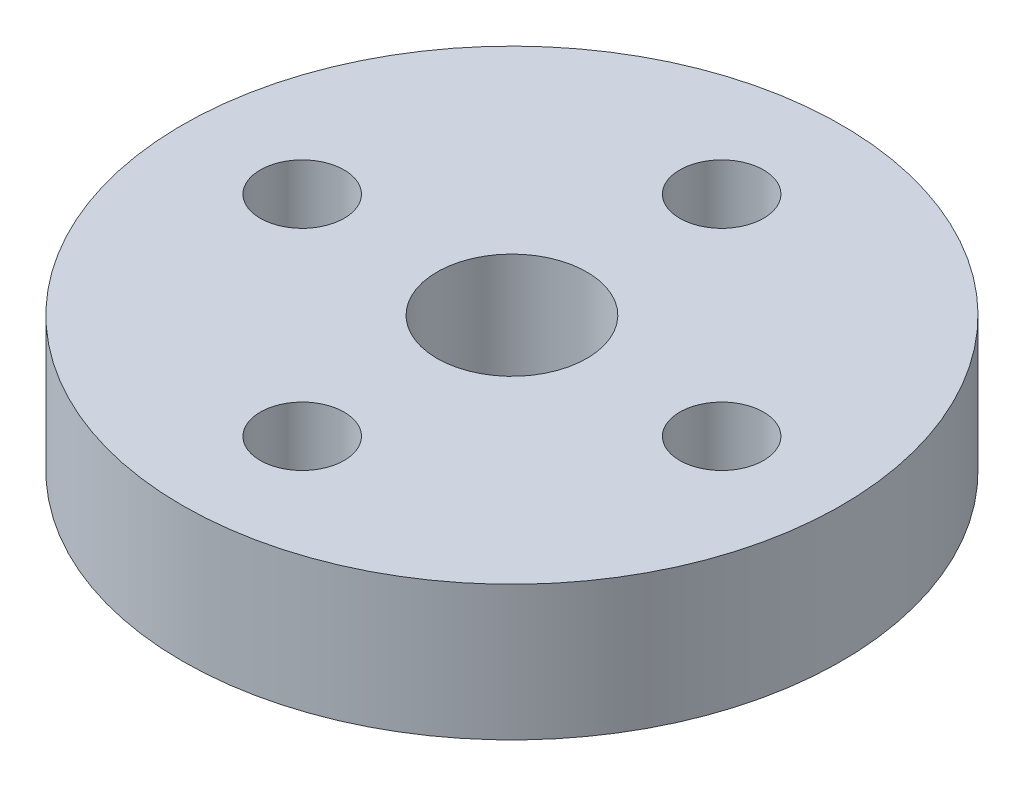
ISO-10303-21;
HEADER;
FILE_DESCRIPTION(('STEP AP214'),'2;1');
FILE_NAME('part.step','',(''),(''),'','','');
FILE_SCHEMA(('AUTOMOTIVE_DESIGN { 1 0 10303 214 1 1 1 1 }'));
ENDSEC;
DATA;
#1=APPLICATION_CONTEXT('core data for automotive mechanical design processes');
#2=APPLICATION_PROTOCOL_DEFINITION('international standard','automotive_design',2000,#1);
#3=PRODUCT_CONTEXT('',#1,'mechanical');
#4=PRODUCT('Part','Part','',(#3));
#5=PRODUCT_RELATED_PRODUCT_CATEGORY('part','',(#4));
#6=PRODUCT_DEFINITION_FORMATION('','',#4);
#7=PRODUCT_DEFINITION_CONTEXT('part definition',#1,'design');
#8=PRODUCT_DEFINITION('design','',#6,#7);
#9=PRODUCT_DEFINITION_SHAPE('','',#8);
#10=(LENGTH_UNIT() NAMED_UNIT(*) SI_UNIT(.MILLI.,.METRE.));
#11=(NAMED_UNIT(*) PLANE_ANGLE_UNIT() SI_UNIT($,.RADIAN.));
#12=(NAMED_UNIT(*) SI_UNIT($,.STERADIAN.) SOLID_ANGLE_UNIT());
#13=UNCERTAINTY_MEASURE_WITH_UNIT(LENGTH_MEASURE(1.E-05),#10,'distance_accuracy_value','');
#14=(GEOMETRIC_REPRESENTATION_CONTEXT(3) GLOBAL_UNCERTAINTY_ASSIGNED_CONTEXT((#13)) GLOBAL_UNIT_ASSIGNED_CONTEXT((#10,
#11,#12)) REPRESENTATION_CONTEXT('',''));
#15=CARTESIAN_POINT('',(0.,0.,0.));
#16=DIRECTION('',(0.,0.,1.));
#17=DIRECTION('',(1.,0.,0.));
#18=AXIS2_PLACEMENT_3D('',#15,#16,#17);
#19=CARTESIAN_POINT('',(0.,4.5,0.));
#20=DIRECTION('',(0.,1.,0.));
#21=DIRECTION('',(0.,0.,1.));
#22=AXIS2_PLACEMENT_3D('',#19,#20,#21);
#23=PLANE('',#22);
#24=CARTESIAN_POINT('',(0.,4.5,7.));
#25=DIRECTION('',(0.,1.,0.));
#26=DIRECTION('',(0.,0.,1.));
#27=AXIS2_PLACEMENT_3D('',#24,#25,#26);
#28=CIRCLE('',#27,1.4);
#29=CARTESIAN_POINT('',(0.,4.5,8.4));
#30=VERTEX_POINT('',#29);
#31=EDGE_CURVE('E76',#30,#30,#28,.T.);
#32=ORIENTED_EDGE('',*,*,#31,.F.);
#33=EDGE_LOOP('',(#32));
#34=FACE_BOUND('',#33,.T.);
#35=CARTESIAN_POINT('',(0.,4.5,-7.));
#36=DIRECTION('',(0.,1.,0.));
#37=DIRECTION('',(0.,0.,1.));
#38=AXIS2_PLACEMENT_3D('',#35,#36,#37);
#39=CIRCLE('',#38,1.4);
#40=CARTESIAN_POINT('',(0.,4.5,-5.6));
#41=VERTEX_POINT('',#40);
#42=EDGE_CURVE('E60',#41,#41,#39,.T.);
#43=ORIENTED_EDGE('',*,*,#42,.F.);
#44=EDGE_LOOP('',(#43));
#45=FACE_BOUND('',#44,.T.);
#46=CARTESIAN_POINT('',(0.,4.5,0.));
#47=DIRECTION('',(0.,1.,0.));
#48=DIRECTION('',(0.,0.,1.));
#49=AXIS2_PLACEMENT_3D('',#46,#47,#48);
#50=CIRCLE('',#49,11.);
#51=CARTESIAN_POINT('',(0.,4.5,11.));
#52=VERTEX_POINT('',#51);
#53=EDGE_CURVE('E10',#52,#52,#50,.T.);
#54=ORIENTED_EDGE('',*,*,#53,.T.);
#55=EDGE_LOOP('',(#54));
#56=FACE_BOUND('',#55,.T.);
#57=CARTESIAN_POINT('',(0.,4.5,0.));
#58=DIRECTION('',(0.,1.,0.));
#59=DIRECTION('',(0.,0.,1.));
#60=AXIS2_PLACEMENT_3D('',#57,#58,#59);
#61=CIRCLE('',#60,2.5);
#62=CARTESIAN_POINT('',(0.,4.5,2.5));
#63=VERTEX_POINT('',#62);
#64=EDGE_CURVE('E54',#63,#63,#61,.T.);
#65=ORIENTED_EDGE('',*,*,#64,.F.);
#66=EDGE_LOOP('',(#65));
#67=FACE_BOUND('',#66,.T.);
#68=CARTESIAN_POINT('',(7.,4.5,0.));
#69=DIRECTION('',(0.,1.,0.));
#70=DIRECTION('',(0.,0.,1.));
#71=AXIS2_PLACEMENT_3D('',#68,#69,#70);
#72=CIRCLE('',#71,1.4);
#73=CARTESIAN_POINT('',(7.,4.5,1.4));
#74=VERTEX_POINT('',#73);
#75=EDGE_CURVE('E68',#74,#74,#72,.T.);
#76=ORIENTED_EDGE('',*,*,#75,.F.);
#77=EDGE_LOOP('',(#76));
#78=FACE_BOUND('',#77,.T.);
#79=CARTESIAN_POINT('',(-7.,4.5,0.));
#80=DIRECTION('',(0.,1.,0.));
#81=DIRECTION('',(0.,0.,1.));
#82=AXIS2_PLACEMENT_3D('',#79,#80,#81);
#83=CIRCLE('',#82,1.4);
#84=CARTESIAN_POINT('',(-7.,4.5,1.4));
#85=VERTEX_POINT('',#84);
#86=EDGE_CURVE('E84',#85,#85,#83,.T.);
#87=ORIENTED_EDGE('',*,*,#86,.F.);
#88=EDGE_LOOP('',(#87));
#89=FACE_BOUND('',#88,.T.);
#90=ADVANCED_FACE('F41',(#34,#45,#56,#67,#78,#89),#23,.T.);
#91=CARTESIAN_POINT('',(0.,0.,0.));
#92=DIRECTION('',(0.,1.,0.));
#93=DIRECTION('',(0.,0.,1.));
#94=AXIS2_PLACEMENT_3D('',#91,#92,#93);
#95=PLANE('',#94);
#96=CARTESIAN_POINT('',(0.,0.,0.));
#97=DIRECTION('',(0.,1.,0.));
#98=DIRECTION('',(0.,0.,1.));
#99=AXIS2_PLACEMENT_3D('',#96,#97,#98);
#100=CIRCLE('',#99,11.);
#101=CARTESIAN_POINT('',(0.,0.,11.));
#102=VERTEX_POINT('',#101);
#103=EDGE_CURVE('E45',#102,#102,#100,.T.);
#104=ORIENTED_EDGE('',*,*,#103,.F.);
#105=EDGE_LOOP('',(#104));
#106=FACE_BOUND('',#105,.T.);
#107=CARTESIAN_POINT('',(0.,0.,0.));
#108=DIRECTION('',(0.,1.,0.));
#109=DIRECTION('',(0.,0.,1.));
#110=AXIS2_PLACEMENT_3D('',#107,#108,#109);
#111=CIRCLE('',#110,2.5);
#112=CARTESIAN_POINT('',(0.,0.,2.5));
#113=VERTEX_POINT('',#112);
#114=EDGE_CURVE('E56',#113,#113,#111,.T.);
#115=ORIENTED_EDGE('',*,*,#114,.T.);
#116=EDGE_LOOP('',(#115));
#117=FACE_BOUND('',#116,.T.);
#118=CARTESIAN_POINT('',(0.,0.,-7.));
#119=DIRECTION('',(0.,1.,0.));
#120=DIRECTION('',(0.,0.,1.));
#121=AXIS2_PLACEMENT_3D('',#118,#119,#120);
#122=CIRCLE('',#121,1.4);
#123=CARTESIAN_POINT('',(0.,0.,-5.6));
#124=VERTEX_POINT('',#123);
#125=EDGE_CURVE('E64',#124,#124,#122,.T.);
#126=ORIENTED_EDGE('',*,*,#125,.T.);
#127=EDGE_LOOP('',(#126));
#128=FACE_BOUND('',#127,.T.);
#129=CARTESIAN_POINT('',(7.,0.,0.));
#130=DIRECTION('',(0.,1.,0.));
#131=DIRECTION('',(0.,0.,1.));
#132=AXIS2_PLACEMENT_3D('',#129,#130,#131);
#133=CIRCLE('',#132,1.4);
#134=CARTESIAN_POINT('',(7.,0.,1.4));
#135=VERTEX_POINT('',#134);
#136=EDGE_CURVE('E72',#135,#135,#133,.T.);
#137=ORIENTED_EDGE('',*,*,#136,.T.);
#138=EDGE_LOOP('',(#137));
#139=FACE_BOUND('',#138,.T.);
#140=CARTESIAN_POINT('',(0.,0.,7.));
#141=DIRECTION('',(0.,1.,0.));
#142=DIRECTION('',(0.,0.,1.));
#143=AXIS2_PLACEMENT_3D('',#140,#141,#142);
#144=CIRCLE('',#143,1.4);
#145=CARTESIAN_POINT('',(0.,0.,8.4));
#146=VERTEX_POINT('',#145);
#147=EDGE_CURVE('E80',#146,#146,#144,.T.);
#148=ORIENTED_EDGE('',*,*,#147,.T.);
#149=EDGE_LOOP('',(#148));
#150=FACE_BOUND('',#149,.T.);
#151=CARTESIAN_POINT('',(-7.,0.,0.));
#152=DIRECTION('',(0.,1.,0.));
#153=DIRECTION('',(0.,0.,1.));
#154=AXIS2_PLACEMENT_3D('',#151,#152,#153);
#155=CIRCLE('',#154,1.4);
#156=CARTESIAN_POINT('',(-7.,0.,1.4));
#157=VERTEX_POINT('',#156);
#158=EDGE_CURVE('E88',#157,#157,#155,.T.);
#159=ORIENTED_EDGE('',*,*,#158,.T.);
#160=EDGE_LOOP('',(#159));
#161=FACE_BOUND('',#160,.T.);
#162=ADVANCED_FACE('F100',(#106,#117,#128,#139,#150,#161),#95,.F.);
#163=CARTESIAN_POINT('',(0.,4.5,0.));
#164=DIRECTION('',(0.,-1.,0.));
#165=DIRECTION('',(0.,0.,-1.));
#166=AXIS2_PLACEMENT_3D('',#163,#164,#165);
#167=CYLINDRICAL_SURFACE('',#166,11.);
#168=ORIENTED_EDGE('',*,*,#53,.F.);
#169=EDGE_LOOP('',(#168));
#170=FACE_BOUND('',#169,.T.);
#171=ORIENTED_EDGE('',*,*,#103,.T.);
#172=EDGE_LOOP('',(#171));
#173=FACE_BOUND('',#172,.T.);
#174=ADVANCED_FACE('F43',(#170,#173),#167,.T.);
#175=CARTESIAN_POINT('',(0.,4.5,0.));
#176=DIRECTION('',(0.,-1.,0.));
#177=DIRECTION('',(0.,0.,-1.));
#178=AXIS2_PLACEMENT_3D('',#175,#176,#177);
#179=CYLINDRICAL_SURFACE('',#178,2.5);
#180=ORIENTED_EDGE('',*,*,#64,.T.);
#181=EDGE_LOOP('',(#180));
#182=FACE_BOUND('',#181,.T.);
#183=ORIENTED_EDGE('',*,*,#114,.F.);
#184=EDGE_LOOP('',(#183));
#185=FACE_BOUND('',#184,.T.);
#186=ADVANCED_FACE('F110',(#182,#185),#179,.F.);
#187=CARTESIAN_POINT('',(0.,4.5,-7.));
#188=DIRECTION('',(0.,-1.,0.));
#189=DIRECTION('',(0.,0.,-1.));
#190=AXIS2_PLACEMENT_3D('',#187,#188,#189);
#191=CYLINDRICAL_SURFACE('',#190,1.4);
#192=ORIENTED_EDGE('',*,*,#42,.T.);
#193=EDGE_LOOP('',(#192));
#194=FACE_BOUND('',#193,.T.);
#195=ORIENTED_EDGE('',*,*,#125,.F.);
#196=EDGE_LOOP('',(#195));
#197=FACE_BOUND('',#196,.T.);
#198=ADVANCED_FACE('F113',(#194,#197),#191,.F.);
#199=CARTESIAN_POINT('',(7.,4.5,0.));
#200=DIRECTION('',(0.,-1.,0.));
#201=DIRECTION('',(0.,0.,-1.));
#202=AXIS2_PLACEMENT_3D('',#199,#200,#201);
#203=CYLINDRICAL_SURFACE('',#202,1.4);
#204=ORIENTED_EDGE('',*,*,#75,.T.);
#205=EDGE_LOOP('',(#204));
#206=FACE_BOUND('',#205,.T.);
#207=ORIENTED_EDGE('',*,*,#136,.F.);
#208=EDGE_LOOP('',(#207));
#209=FACE_BOUND('',#208,.T.);
#210=ADVANCED_FACE('F117',(#206,#209),#203,.F.);
#211=CARTESIAN_POINT('',(0.,4.5,7.));
#212=DIRECTION('',(0.,-1.,0.));
#213=DIRECTION('',(0.,0.,-1.));
#214=AXIS2_PLACEMENT_3D('',#211,#212,#213);
#215=CYLINDRICAL_SURFACE('',#214,1.4);
#216=ORIENTED_EDGE('',*,*,#31,.T.);
#217=EDGE_LOOP('',(#216));
#218=FACE_BOUND('',#217,.T.);
#219=ORIENTED_EDGE('',*,*,#147,.F.);
#220=EDGE_LOOP('',(#219));
#221=FACE_BOUND('',#220,.T.);
#222=ADVANCED_FACE('F121',(#218,#221),#215,.F.);
#223=CARTESIAN_POINT('',(-7.,4.5,0.));
#224=DIRECTION('',(0.,-1.,0.));
#225=DIRECTION('',(0.,0.,-1.));
#226=AXIS2_PLACEMENT_3D('',#223,#224,#225);
#227=CYLINDRICAL_SURFACE('',#226,1.4);
#228=ORIENTED_EDGE('',*,*,#86,.T.);
#229=EDGE_LOOP('',(#228));
#230=FACE_BOUND('',#229,.T.);
#231=ORIENTED_EDGE('',*,*,#158,.F.);
#232=EDGE_LOOP('',(#231));
#233=FACE_BOUND('',#232,.T.);
#234=ADVANCED_FACE('F96',(#230,#233),#227,.F.);
#235=CLOSED_SHELL('',(#90,#162,#174,#186,#198,#210,#222,#234));
#236=MANIFOLD_SOLID_BREP('B2',#235);
#237=ADVANCED_BREP_SHAPE_REPRESENTATION('',(#18,#236),#14);
#238=SHAPE_DEFINITION_REPRESENTATION(#9,#237);
ENDSEC;
END-ISO-10303-21;
